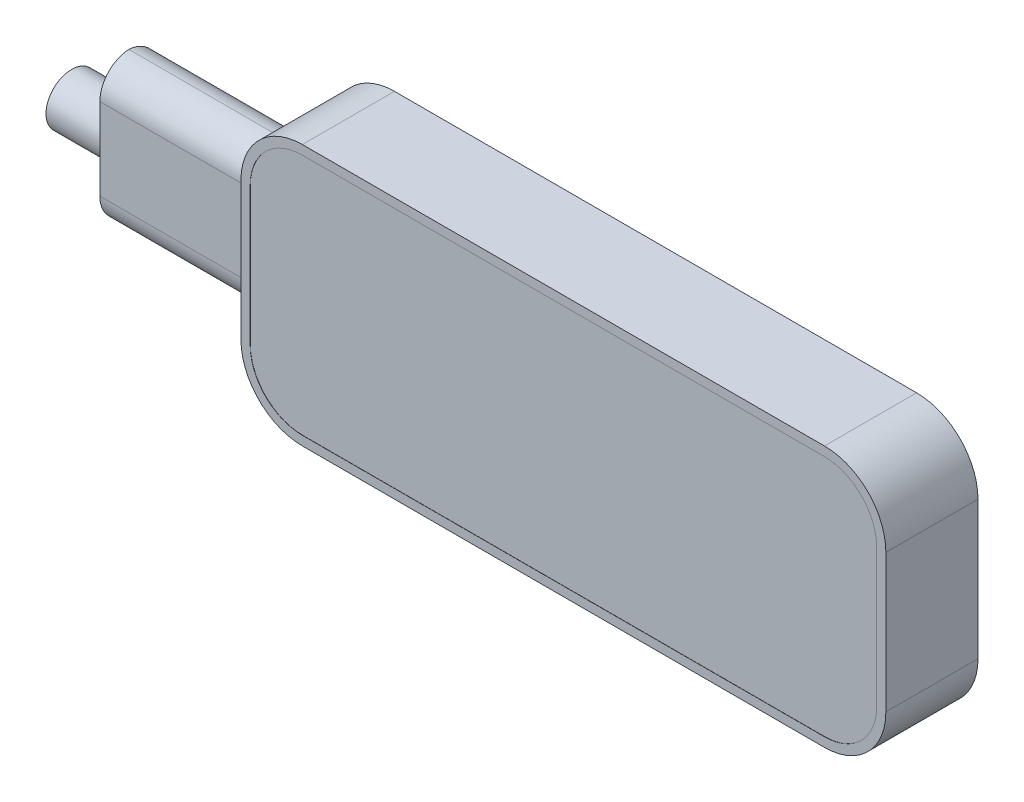
ISO-10303-21;
HEADER;
FILE_DESCRIPTION(('STEP AP214'),'2;1');
FILE_NAME('part.step','',(''),(''),'','','');
FILE_SCHEMA(('AUTOMOTIVE_DESIGN { 1 0 10303 214 1 1 1 1 }'));
ENDSEC;
DATA;
#1=APPLICATION_CONTEXT('core data for automotive mechanical design processes');
#2=APPLICATION_PROTOCOL_DEFINITION('international standard','automotive_design',2000,#1);
#3=PRODUCT_CONTEXT('',#1,'mechanical');
#4=PRODUCT('Part','Part','',(#3));
#5=PRODUCT_RELATED_PRODUCT_CATEGORY('part','',(#4));
#6=PRODUCT_DEFINITION_FORMATION('','',#4);
#7=PRODUCT_DEFINITION_CONTEXT('part definition',#1,'design');
#8=PRODUCT_DEFINITION('design','',#6,#7);
#9=PRODUCT_DEFINITION_SHAPE('','',#8);
#10=(LENGTH_UNIT() NAMED_UNIT(*) SI_UNIT(.MILLI.,.METRE.));
#11=(NAMED_UNIT(*) PLANE_ANGLE_UNIT() SI_UNIT($,.RADIAN.));
#12=(NAMED_UNIT(*) SI_UNIT($,.STERADIAN.) SOLID_ANGLE_UNIT());
#13=UNCERTAINTY_MEASURE_WITH_UNIT(LENGTH_MEASURE(1.E-05),#10,'distance_accuracy_value','');
#14=(GEOMETRIC_REPRESENTATION_CONTEXT(3) GLOBAL_UNCERTAINTY_ASSIGNED_CONTEXT((#13)) GLOBAL_UNIT_ASSIGNED_CONTEXT((#10,
#11,#12)) REPRESENTATION_CONTEXT('',''));
#15=CARTESIAN_POINT('',(0.,0.,0.));
#16=DIRECTION('',(0.,0.,1.));
#17=DIRECTION('',(1.,0.,0.));
#18=AXIS2_PLACEMENT_3D('',#15,#16,#17);
#19=CARTESIAN_POINT('',(-60.6806,8.88999999999998,8.26067024554706));
#20=DIRECTION('',(0.,0.,-1.));
#21=DIRECTION('',(0.,1.,0.));
#22=AXIS2_PLACEMENT_3D('',#19,#20,#21);
#23=PLANE('',#22);
#24=DIRECTION('',(0.,1.,0.));
#25=VECTOR('',#24,1.);
#26=CARTESIAN_POINT('',(-60.6806,8.88999999999998,8.26067024554706));
#27=LINE('',#26,#25);
#28=CARTESIAN_POINT('',(-60.6806,-5.08000000000001,8.26067024554706));
#29=VERTEX_POINT('',#28);
#30=CARTESIAN_POINT('',(-60.6806,5.07999999999999,8.26067024554706));
#31=VERTEX_POINT('',#30);
#32=EDGE_CURVE('E107',#29,#31,#27,.T.);
#33=ORIENTED_EDGE('',*,*,#32,.F.);
#34=DIRECTION('',(1.,0.,0.));
#35=VECTOR('',#34,1.);
#36=CARTESIAN_POINT('',(-60.6806,-5.08000000000001,8.26067024554706));
#37=LINE('',#36,#35);
#38=CARTESIAN_POINT('',(-40.0304,-5.08000000000001,8.26067024554706));
#39=VERTEX_POINT('',#38);
#40=EDGE_CURVE('E12',#29,#39,#37,.T.);
#41=ORIENTED_EDGE('',*,*,#40,.T.);
#42=DIRECTION('',(0.,1.,0.));
#43=VECTOR('',#42,1.);
#44=CARTESIAN_POINT('',(-40.0304,8.88999999999999,8.26067024554706));
#45=LINE('',#44,#43);
#46=CARTESIAN_POINT('',(-40.0304,5.07999999999999,8.26067024554706));
#47=VERTEX_POINT('',#46);
#48=EDGE_CURVE('E105',#39,#47,#45,.T.);
#49=ORIENTED_EDGE('',*,*,#48,.T.);
#50=DIRECTION('',(1.,0.,0.));
#51=VECTOR('',#50,1.);
#52=CARTESIAN_POINT('',(-60.6806,5.07999999999999,8.26067024554706));
#53=LINE('',#52,#51);
#54=EDGE_CURVE('E58',#47,#31,#53,.F.);
#55=ORIENTED_EDGE('',*,*,#54,.T.);
#56=EDGE_LOOP('',(#33,#41,#49,#55));
#57=FACE_BOUND('',#56,.T.);
#58=ADVANCED_FACE('F49',(#57),#23,.F.);
#59=CARTESIAN_POINT('',(-60.6806,8.88999999999998,1.07247024554706));
#60=DIRECTION('',(0.,0.,1.));
#61=DIRECTION('',(0.,-1.,0.));
#62=AXIS2_PLACEMENT_3D('',#59,#60,#61);
#63=PLANE('',#62);
#64=DIRECTION('',(0.,-1.,0.));
#65=VECTOR('',#64,1.);
#66=CARTESIAN_POINT('',(-40.0304,8.88999999999999,1.07247024554706));
#67=LINE('',#66,#65);
#68=CARTESIAN_POINT('',(-40.0304,5.07999999999999,1.07247024554706));
#69=VERTEX_POINT('',#68);
#70=CARTESIAN_POINT('',(-40.0304,-5.08000000000001,1.07247024554707));
#71=VERTEX_POINT('',#70);
#72=EDGE_CURVE('E116',#69,#71,#67,.T.);
#73=ORIENTED_EDGE('',*,*,#72,.T.);
#74=DIRECTION('',(1.,0.,0.));
#75=VECTOR('',#74,1.);
#76=CARTESIAN_POINT('',(-60.6806,-5.08000000000002,1.07247024554707));
#77=LINE('',#76,#75);
#78=CARTESIAN_POINT('',(-60.6806,-5.08000000000002,1.07247024554707));
#79=VERTEX_POINT('',#78);
#80=EDGE_CURVE('E132',#71,#79,#77,.F.);
#81=ORIENTED_EDGE('',*,*,#80,.T.);
#82=DIRECTION('',(0.,-1.,0.));
#83=VECTOR('',#82,1.);
#84=CARTESIAN_POINT('',(-60.6806,8.88999999999998,1.07247024554706));
#85=LINE('',#84,#83);
#86=CARTESIAN_POINT('',(-60.6806,5.07999999999998,1.07247024554706));
#87=VERTEX_POINT('',#86);
#88=EDGE_CURVE('E155',#87,#79,#85,.T.);
#89=ORIENTED_EDGE('',*,*,#88,.F.);
#90=DIRECTION('',(1.,0.,0.));
#91=VECTOR('',#90,1.);
#92=CARTESIAN_POINT('',(-60.6806,5.07999999999998,1.07247024554706));
#93=LINE('',#92,#91);
#94=EDGE_CURVE('E125',#87,#69,#93,.T.);
#95=ORIENTED_EDGE('',*,*,#94,.T.);
#96=EDGE_LOOP('',(#73,#81,#89,#95));
#97=FACE_BOUND('',#96,.T.);
#98=ADVANCED_FACE('F161',(#97),#63,.F.);
#99=CARTESIAN_POINT('',(-60.6806,0.,0.));
#100=DIRECTION('',(-1.,0.,0.));
#101=DIRECTION('',(0.,0.,1.));
#102=AXIS2_PLACEMENT_3D('',#99,#100,#101);
#103=PLANE('',#102);
#104=CARTESIAN_POINT('',(-60.6806,0.,4.65366807469536));
#105=DIRECTION('',(-1.,0.,0.));
#106=DIRECTION('',(0.,0.,1.));
#107=AXIS2_PLACEMENT_3D('',#104,#105,#106);
#108=CIRCLE('',#107,3.175);
#109=CARTESIAN_POINT('',(-60.6806,0.,7.82866807469536));
#110=VERTEX_POINT('',#109);
#111=EDGE_CURVE('E147',#110,#110,#108,.T.);
#112=ORIENTED_EDGE('',*,*,#111,.F.);
#113=EDGE_LOOP('',(#112));
#114=FACE_BOUND('',#113,.T.);
#115=ORIENTED_EDGE('',*,*,#88,.T.);
#116=CARTESIAN_POINT('',(-60.6806,-5.08000000000001,4.88247024554706));
#117=DIRECTION('',(-1.,0.,0.));
#118=DIRECTION('',(0.,0.,1.));
#119=AXIS2_PLACEMENT_3D('',#116,#117,#118);
#120=CIRCLE('',#119,3.81);
#121=CARTESIAN_POINT('',(-60.6806,-8.88387791470758,4.66657024554707));
#122=VERTEX_POINT('',#121);
#123=EDGE_CURVE('E66',#79,#122,#120,.T.);
#124=ORIENTED_EDGE('',*,*,#123,.T.);
#125=CARTESIAN_POINT('',(-60.6806,-5.08000000000001,4.45067024554707));
#126=DIRECTION('',(-1.,0.,0.));
#127=DIRECTION('',(0.,0.,1.));
#128=AXIS2_PLACEMENT_3D('',#125,#126,#127);
#129=CIRCLE('',#128,3.81);
#130=EDGE_CURVE('E138',#122,#29,#129,.T.);
#131=ORIENTED_EDGE('',*,*,#130,.T.);
#132=ORIENTED_EDGE('',*,*,#32,.T.);
#133=CARTESIAN_POINT('',(-60.6806,5.07999999999999,4.45067024554706));
#134=DIRECTION('',(-1.,0.,0.));
#135=DIRECTION('',(0.,0.,1.));
#136=AXIS2_PLACEMENT_3D('',#133,#134,#135);
#137=CIRCLE('',#136,3.81);
#138=CARTESIAN_POINT('',(-60.6806,8.88387791470755,4.66657024554706));
#139=VERTEX_POINT('',#138);
#140=EDGE_CURVE('E73',#31,#139,#137,.T.);
#141=ORIENTED_EDGE('',*,*,#140,.T.);
#142=CARTESIAN_POINT('',(-60.6806,5.07999999999999,4.88247024554706));
#143=DIRECTION('',(-1.,0.,0.));
#144=DIRECTION('',(0.,0.,1.));
#145=AXIS2_PLACEMENT_3D('',#142,#143,#144);
#146=CIRCLE('',#145,3.81);
#147=EDGE_CURVE('E136',#139,#87,#146,.T.);
#148=ORIENTED_EDGE('',*,*,#147,.T.);
#149=EDGE_LOOP('',(#115,#124,#131,#132,#141,#148));
#150=FACE_BOUND('',#149,.T.);
#151=ADVANCED_FACE('F179',(#114,#150),#103,.T.);
#152=CARTESIAN_POINT('',(-40.0304,0.,0.));
#153=DIRECTION('',(-1.,0.,0.));
#154=DIRECTION('',(0.,0.,1.));
#155=AXIS2_PLACEMENT_3D('',#152,#153,#154);
#156=PLANE('',#155);
#157=CARTESIAN_POINT('',(-40.0304,-5.08000000000001,4.45067024554707));
#158=DIRECTION('',(-1.,0.,0.));
#159=DIRECTION('',(0.,0.,1.));
#160=AXIS2_PLACEMENT_3D('',#157,#158,#159);
#161=CIRCLE('',#160,3.81);
#162=CARTESIAN_POINT('',(-40.0304,-8.88387791470758,4.66657024554707));
#163=VERTEX_POINT('',#162);
#164=EDGE_CURVE('E112',#39,#163,#161,.F.);
#165=ORIENTED_EDGE('',*,*,#164,.T.);
#166=CARTESIAN_POINT('',(-40.0304,-5.08000000000001,4.88247024554706));
#167=DIRECTION('',(-1.,0.,0.));
#168=DIRECTION('',(0.,0.,1.));
#169=AXIS2_PLACEMENT_3D('',#166,#167,#168);
#170=CIRCLE('',#169,3.81);
#171=EDGE_CURVE('E122',#163,#71,#170,.F.);
#172=ORIENTED_EDGE('',*,*,#171,.T.);
#173=ORIENTED_EDGE('',*,*,#72,.F.);
#174=CARTESIAN_POINT('',(-40.0304,5.07999999999999,4.88247024554706));
#175=DIRECTION('',(-1.,0.,0.));
#176=DIRECTION('',(0.,0.,1.));
#177=AXIS2_PLACEMENT_3D('',#174,#175,#176);
#178=CIRCLE('',#177,3.81);
#179=CARTESIAN_POINT('',(-40.0304,8.88387791470756,4.66657024554706));
#180=VERTEX_POINT('',#179);
#181=EDGE_CURVE('E123',#69,#180,#178,.F.);
#182=ORIENTED_EDGE('',*,*,#181,.T.);
#183=CARTESIAN_POINT('',(-40.0304,5.07999999999999,4.45067024554706));
#184=DIRECTION('',(-1.,0.,0.));
#185=DIRECTION('',(0.,0.,1.));
#186=AXIS2_PLACEMENT_3D('',#183,#184,#185);
#187=CIRCLE('',#186,3.81);
#188=EDGE_CURVE('E115',#180,#47,#187,.F.);
#189=ORIENTED_EDGE('',*,*,#188,.T.);
#190=ORIENTED_EDGE('',*,*,#48,.F.);
#191=EDGE_LOOP('',(#165,#172,#173,#182,#189,#190));
#192=FACE_BOUND('',#191,.T.);
#193=ADVANCED_FACE('F111',(#192),#156,.F.);
#194=CARTESIAN_POINT('',(-60.6806,-5.08000000000001,4.45067024554707));
#195=DIRECTION('',(1.,0.,0.));
#196=DIRECTION('',(0.,1.,0.));
#197=AXIS2_PLACEMENT_3D('',#194,#195,#196);
#198=CYLINDRICAL_SURFACE('',#197,3.81);
#199=ORIENTED_EDGE('',*,*,#40,.F.);
#200=ORIENTED_EDGE('',*,*,#130,.F.);
#201=DIRECTION('',(1.,0.,0.));
#202=VECTOR('',#201,1.);
#203=CARTESIAN_POINT('',(-50.3555,-8.88387791470758,4.66657024554707));
#204=LINE('',#203,#202);
#205=EDGE_CURVE('E117',#163,#122,#204,.F.);
#206=ORIENTED_EDGE('',*,*,#205,.F.);
#207=ORIENTED_EDGE('',*,*,#164,.F.);
#208=EDGE_LOOP('',(#199,#200,#206,#207));
#209=FACE_BOUND('',#208,.T.);
#210=ADVANCED_FACE('F119',(#209),#198,.T.);
#211=CARTESIAN_POINT('',(-60.6806,-5.08000000000001,4.88247024554706));
#212=DIRECTION('',(1.,0.,0.));
#213=DIRECTION('',(0.,1.,0.));
#214=AXIS2_PLACEMENT_3D('',#211,#212,#213);
#215=CYLINDRICAL_SURFACE('',#214,3.81);
#216=ORIENTED_EDGE('',*,*,#123,.F.);
#217=ORIENTED_EDGE('',*,*,#80,.F.);
#218=ORIENTED_EDGE('',*,*,#171,.F.);
#219=ORIENTED_EDGE('',*,*,#205,.T.);
#220=EDGE_LOOP('',(#216,#217,#218,#219));
#221=FACE_BOUND('',#220,.T.);
#222=ADVANCED_FACE('F164',(#221),#215,.T.);
#223=CARTESIAN_POINT('',(-60.6806,5.07999999999999,4.45067024554706));
#224=DIRECTION('',(1.,0.,0.));
#225=DIRECTION('',(0.,1.,0.));
#226=AXIS2_PLACEMENT_3D('',#223,#224,#225);
#227=CYLINDRICAL_SURFACE('',#226,3.81);
#228=DIRECTION('',(1.,0.,0.));
#229=VECTOR('',#228,1.);
#230=CARTESIAN_POINT('',(-50.3555,8.88387791470756,4.66657024554706));
#231=LINE('',#230,#229);
#232=EDGE_CURVE('E53',#139,#180,#231,.T.);
#233=ORIENTED_EDGE('',*,*,#232,.F.);
#234=ORIENTED_EDGE('',*,*,#140,.F.);
#235=ORIENTED_EDGE('',*,*,#54,.F.);
#236=ORIENTED_EDGE('',*,*,#188,.F.);
#237=EDGE_LOOP('',(#233,#234,#235,#236));
#238=FACE_BOUND('',#237,.T.);
#239=ADVANCED_FACE('F51',(#238),#227,.T.);
#240=CARTESIAN_POINT('',(-60.6806,5.07999999999999,4.88247024554706));
#241=DIRECTION('',(1.,0.,0.));
#242=DIRECTION('',(0.,1.,0.));
#243=AXIS2_PLACEMENT_3D('',#240,#241,#242);
#244=CYLINDRICAL_SURFACE('',#243,3.81);
#245=ORIENTED_EDGE('',*,*,#147,.F.);
#246=ORIENTED_EDGE('',*,*,#232,.T.);
#247=ORIENTED_EDGE('',*,*,#181,.F.);
#248=ORIENTED_EDGE('',*,*,#94,.F.);
#249=EDGE_LOOP('',(#245,#246,#247,#248));
#250=FACE_BOUND('',#249,.T.);
#251=ADVANCED_FACE('F171',(#250),#244,.T.);
#252=CARTESIAN_POINT('',(-67.7926,0.,4.65366807469536));
#253=DIRECTION('',(1.,0.,0.));
#254=DIRECTION('',(0.,0.,-1.));
#255=AXIS2_PLACEMENT_3D('',#252,#253,#254);
#256=CYLINDRICAL_SURFACE('',#255,3.175);
#257=CARTESIAN_POINT('',(-67.7926,0.,4.65366807469536));
#258=DIRECTION('',(-1.,0.,0.));
#259=DIRECTION('',(0.,0.,1.));
#260=AXIS2_PLACEMENT_3D('',#257,#258,#259);
#261=CIRCLE('',#260,3.175);
#262=CARTESIAN_POINT('',(-67.7926,0.,7.82866807469536));
#263=VERTEX_POINT('',#262);
#264=EDGE_CURVE('E143',#263,#263,#261,.T.);
#265=ORIENTED_EDGE('',*,*,#264,.F.);
#266=EDGE_LOOP('',(#265));
#267=FACE_BOUND('',#266,.T.);
#268=ORIENTED_EDGE('',*,*,#111,.T.);
#269=EDGE_LOOP('',(#268));
#270=FACE_BOUND('',#269,.T.);
#271=ADVANCED_FACE('F187',(#267,#270),#256,.T.);
#272=CARTESIAN_POINT('',(-67.7926,0.,4.65366807469536));
#273=DIRECTION('',(-1.,0.,0.));
#274=DIRECTION('',(0.,0.,1.));
#275=AXIS2_PLACEMENT_3D('',#272,#273,#274);
#276=PLANE('',#275);
#277=ORIENTED_EDGE('',*,*,#264,.T.);
#278=EDGE_LOOP('',(#277));
#279=FACE_BOUND('',#278,.T.);
#280=ADVANCED_FACE('F190',(#279),#276,.T.);
#281=CLOSED_SHELL('',(#58,#98,#151,#193,#210,#222,#239,#251,#271,#280));
#282=MANIFOLD_SOLID_BREP('B2',#281);
#283=CARTESIAN_POINT('',(-40.005,16.1925,11.43));
#284=DIRECTION('',(1.,0.,0.));
#285=DIRECTION('',(0.,1.,0.));
#286=AXIS2_PLACEMENT_3D('',#283,#284,#285);
#287=PLANE('',#286);
#288=DIRECTION('',(0.,0.,-1.));
#289=VECTOR('',#288,1.);
#290=CARTESIAN_POINT('',(-40.005,6.73099999999999,2.56361871542765));
#291=LINE('',#290,#289);
#292=CARTESIAN_POINT('',(-40.005,6.73099999999999,5.73861871542765));
#293=VERTEX_POINT('',#292);
#294=CARTESIAN_POINT('',(-40.005,6.73099999999999,2.56361871542765));
#295=VERTEX_POINT('',#294);
#296=EDGE_CURVE('E421',#293,#295,#291,.T.);
#297=ORIENTED_EDGE('',*,*,#296,.F.);
#298=DIRECTION('',(0.,1.,0.));
#299=VECTOR('',#298,1.);
#300=CARTESIAN_POINT('',(-40.005,6.73099999999999,5.73861871542765));
#301=LINE('',#300,#299);
#302=CARTESIAN_POINT('',(-40.005,-6.73100000000001,5.73861871542765));
#303=VERTEX_POINT('',#302);
#304=EDGE_CURVE('E270',#303,#293,#301,.T.);
#305=ORIENTED_EDGE('',*,*,#304,.F.);
#306=DIRECTION('',(0.,0.,1.));
#307=VECTOR('',#306,1.);
#308=CARTESIAN_POINT('',(-40.005,-6.73100000000001,2.56361871542765));
#309=LINE('',#308,#307);
#310=CARTESIAN_POINT('',(-40.005,-6.73100000000001,2.56361871542765));
#311=VERTEX_POINT('',#310);
#312=EDGE_CURVE('E412',#311,#303,#309,.T.);
#313=ORIENTED_EDGE('',*,*,#312,.F.);
#314=DIRECTION('',(0.,-1.,0.));
#315=VECTOR('',#314,1.);
#316=CARTESIAN_POINT('',(-40.005,6.73099999999999,2.56361871542765));
#317=LINE('',#316,#315);
#318=EDGE_CURVE('E415',#295,#311,#317,.T.);
#319=ORIENTED_EDGE('',*,*,#318,.F.);
#320=EDGE_LOOP('',(#297,#305,#313,#319));
#321=FACE_BOUND('',#320,.T.);
#322=DIRECTION('',(0.,-1.,0.));
#323=VECTOR('',#322,1.);
#324=CARTESIAN_POINT('',(-40.005,16.1925,0.));
#325=LINE('',#324,#323);
#326=CARTESIAN_POINT('',(-40.005,8.57249999999999,0.));
#327=VERTEX_POINT('',#326);
#328=CARTESIAN_POINT('',(-40.005,-8.5725,0.));
#329=VERTEX_POINT('',#328);
#330=EDGE_CURVE('E479',#327,#329,#325,.T.);
#331=ORIENTED_EDGE('',*,*,#330,.T.);
#332=DIRECTION('',(0.,0.,-1.));
#333=VECTOR('',#332,1.);
#334=CARTESIAN_POINT('',(-40.005,-8.5725,11.43));
#335=LINE('',#334,#333);
#336=CARTESIAN_POINT('',(-40.005,-8.5725,11.43));
#337=VERTEX_POINT('',#336);
#338=EDGE_CURVE('E532',#329,#337,#335,.F.);
#339=ORIENTED_EDGE('',*,*,#338,.T.);
#340=DIRECTION('',(0.,-1.,0.));
#341=VECTOR('',#340,1.);
#342=CARTESIAN_POINT('',(-40.005,16.1925,11.43));
#343=LINE('',#342,#341);
#344=CARTESIAN_POINT('',(-40.005,8.57249999999999,11.43));
#345=VERTEX_POINT('',#344);
#346=EDGE_CURVE('E493',#345,#337,#343,.T.);
#347=ORIENTED_EDGE('',*,*,#346,.F.);
#348=DIRECTION('',(0.,0.,-1.));
#349=VECTOR('',#348,1.);
#350=CARTESIAN_POINT('',(-40.005,8.57249999999999,11.43));
#351=LINE('',#350,#349);
#352=EDGE_CURVE('E529',#345,#327,#351,.T.);
#353=ORIENTED_EDGE('',*,*,#352,.T.);
#354=EDGE_LOOP('',(#331,#339,#347,#353));
#355=FACE_BOUND('',#354,.T.);
#356=ADVANCED_FACE('F255',(#321,#355),#287,.F.);
#357=CARTESIAN_POINT('',(40.005,-16.1925,11.43));
#358=DIRECTION('',(0.,1.,0.));
#359=DIRECTION('',(-1.,0.,0.));
#360=AXIS2_PLACEMENT_3D('',#357,#358,#359);
#361=PLANE('',#360);
#362=DIRECTION('',(1.,0.,0.));
#363=VECTOR('',#362,1.);
#364=CARTESIAN_POINT('',(40.005,-16.1925,11.43));
#365=LINE('',#364,#363);
#366=CARTESIAN_POINT('',(-32.385,-16.1925,11.43));
#367=VERTEX_POINT('',#366);
#368=CARTESIAN_POINT('',(32.385,-16.1925,11.43));
#369=VERTEX_POINT('',#368);
#370=EDGE_CURVE('E496',#367,#369,#365,.T.);
#371=ORIENTED_EDGE('',*,*,#370,.F.);
#372=DIRECTION('',(0.,0.,-1.));
#373=VECTOR('',#372,1.);
#374=CARTESIAN_POINT('',(-32.385,-16.1925,11.43));
#375=LINE('',#374,#373);
#376=CARTESIAN_POINT('',(-32.385,-16.1925,0.));
#377=VERTEX_POINT('',#376);
#378=EDGE_CURVE('E518',#367,#377,#375,.T.);
#379=ORIENTED_EDGE('',*,*,#378,.T.);
#380=DIRECTION('',(1.,0.,0.));
#381=VECTOR('',#380,1.);
#382=CARTESIAN_POINT('',(40.005,-16.1925,0.));
#383=LINE('',#382,#381);
#384=CARTESIAN_POINT('',(32.385,-16.1925,0.));
#385=VERTEX_POINT('',#384);
#386=EDGE_CURVE('E509',#377,#385,#383,.T.);
#387=ORIENTED_EDGE('',*,*,#386,.T.);
#388=DIRECTION('',(0.,0.,-1.));
#389=VECTOR('',#388,1.);
#390=CARTESIAN_POINT('',(32.385,-16.1925,11.43));
#391=LINE('',#390,#389);
#392=EDGE_CURVE('E506',#385,#369,#391,.F.);
#393=ORIENTED_EDGE('',*,*,#392,.T.);
#394=EDGE_LOOP('',(#371,#379,#387,#393));
#395=FACE_BOUND('',#394,.T.);
#396=ADVANCED_FACE('F571',(#395),#361,.F.);
#397=CARTESIAN_POINT('',(40.005,16.1925,11.43));
#398=DIRECTION('',(-1.,0.,0.));
#399=DIRECTION('',(0.,-1.,0.));
#400=AXIS2_PLACEMENT_3D('',#397,#398,#399);
#401=PLANE('',#400);
#402=DIRECTION('',(0.,1.,0.));
#403=VECTOR('',#402,1.);
#404=CARTESIAN_POINT('',(40.005,16.1925,11.43));
#405=LINE('',#404,#403);
#406=CARTESIAN_POINT('',(40.005,-8.57249999999999,11.43));
#407=VERTEX_POINT('',#406);
#408=CARTESIAN_POINT('',(40.005,8.5725,11.43));
#409=VERTEX_POINT('',#408);
#410=EDGE_CURVE('E500',#407,#409,#405,.T.);
#411=ORIENTED_EDGE('',*,*,#410,.F.);
#412=DIRECTION('',(0.,0.,-1.));
#413=VECTOR('',#412,1.);
#414=CARTESIAN_POINT('',(40.005,-8.57249999999999,11.43));
#415=LINE('',#414,#413);
#416=CARTESIAN_POINT('',(40.005,-8.57249999999999,0.));
#417=VERTEX_POINT('',#416);
#418=EDGE_CURVE('E544',#407,#417,#415,.T.);
#419=ORIENTED_EDGE('',*,*,#418,.T.);
#420=DIRECTION('',(0.,1.,0.));
#421=VECTOR('',#420,1.);
#422=CARTESIAN_POINT('',(40.005,16.1925,0.));
#423=LINE('',#422,#421);
#424=CARTESIAN_POINT('',(40.005,8.5725,0.));
#425=VERTEX_POINT('',#424);
#426=EDGE_CURVE('E512',#417,#425,#423,.T.);
#427=ORIENTED_EDGE('',*,*,#426,.T.);
#428=DIRECTION('',(0.,0.,-1.));
#429=VECTOR('',#428,1.);
#430=CARTESIAN_POINT('',(40.005,8.5725,11.43));
#431=LINE('',#430,#429);
#432=EDGE_CURVE('E542',#425,#409,#431,.F.);
#433=ORIENTED_EDGE('',*,*,#432,.T.);
#434=EDGE_LOOP('',(#411,#419,#427,#433));
#435=FACE_BOUND('',#434,.T.);
#436=ADVANCED_FACE('F580',(#435),#401,.F.);
#437=CARTESIAN_POINT('',(40.005,16.1925,11.43));
#438=DIRECTION('',(0.,-1.,0.));
#439=DIRECTION('',(1.,0.,0.));
#440=AXIS2_PLACEMENT_3D('',#437,#438,#439);
#441=PLANE('',#440);
#442=DIRECTION('',(-1.,0.,0.));
#443=VECTOR('',#442,1.);
#444=CARTESIAN_POINT('',(40.005,16.1925,11.43));
#445=LINE('',#444,#443);
#446=CARTESIAN_POINT('',(32.385,16.1925,11.43));
#447=VERTEX_POINT('',#446);
#448=CARTESIAN_POINT('',(-32.385,16.1925,11.43));
#449=VERTEX_POINT('',#448);
#450=EDGE_CURVE('E503',#447,#449,#445,.T.);
#451=ORIENTED_EDGE('',*,*,#450,.F.);
#452=DIRECTION('',(0.,0.,-1.));
#453=VECTOR('',#452,1.);
#454=CARTESIAN_POINT('',(32.385,16.1925,11.43));
#455=LINE('',#454,#453);
#456=CARTESIAN_POINT('',(32.385,16.1925,0.));
#457=VERTEX_POINT('',#456);
#458=EDGE_CURVE('E47',#447,#457,#455,.T.);
#459=ORIENTED_EDGE('',*,*,#458,.T.);
#460=DIRECTION('',(-1.,0.,0.));
#461=VECTOR('',#460,1.);
#462=CARTESIAN_POINT('',(40.005,16.1925,0.));
#463=LINE('',#462,#461);
#464=CARTESIAN_POINT('',(-32.385,16.1925,0.));
#465=VERTEX_POINT('',#464);
#466=EDGE_CURVE('E497',#457,#465,#463,.T.);
#467=ORIENTED_EDGE('',*,*,#466,.T.);
#468=DIRECTION('',(0.,0.,-1.));
#469=VECTOR('',#468,1.);
#470=CARTESIAN_POINT('',(-32.385,16.1925,11.43));
#471=LINE('',#470,#469);
#472=EDGE_CURVE('E263',#465,#449,#471,.F.);
#473=ORIENTED_EDGE('',*,*,#472,.T.);
#474=EDGE_LOOP('',(#451,#459,#467,#473));
#475=FACE_BOUND('',#474,.T.);
#476=ADVANCED_FACE('F549',(#475),#441,.F.);
#477=CARTESIAN_POINT('',(0.,0.,11.43));
#478=DIRECTION('',(0.,0.,-1.));
#479=DIRECTION('',(-1.,0.,0.));
#480=AXIS2_PLACEMENT_3D('',#477,#478,#479);
#481=PLANE('',#480);
#482=DIRECTION('',(0.,-1.,0.));
#483=VECTOR('',#482,1.);
#484=CARTESIAN_POINT('',(-38.862,8.57249999999999,11.43));
#485=LINE('',#484,#483);
#486=CARTESIAN_POINT('',(-38.862,8.57249999999999,11.43));
#487=VERTEX_POINT('',#486);
#488=CARTESIAN_POINT('',(-38.862,-8.57250000000001,11.43));
#489=VERTEX_POINT('',#488);
#490=EDGE_CURVE('E457',#487,#489,#485,.T.);
#491=ORIENTED_EDGE('',*,*,#490,.F.);
#492=CARTESIAN_POINT('',(-32.385,8.57249999999999,11.43));
#493=DIRECTION('',(0.,0.,1.));
#494=DIRECTION('',(1.,0.,0.));
#495=AXIS2_PLACEMENT_3D('',#492,#493,#494);
#496=CIRCLE('',#495,6.477);
#497=CARTESIAN_POINT('',(-32.385,15.0495,11.43));
#498=VERTEX_POINT('',#497);
#499=EDGE_CURVE('E278',#498,#487,#496,.T.);
#500=ORIENTED_EDGE('',*,*,#499,.F.);
#501=DIRECTION('',(-1.,0.,0.));
#502=VECTOR('',#501,1.);
#503=CARTESIAN_POINT('',(32.385,15.0495,11.43));
#504=LINE('',#503,#502);
#505=CARTESIAN_POINT('',(32.385,15.0495,11.43));
#506=VERTEX_POINT('',#505);
#507=EDGE_CURVE('E434',#506,#498,#504,.T.);
#508=ORIENTED_EDGE('',*,*,#507,.F.);
#509=CARTESIAN_POINT('',(32.385,8.5725,11.43));
#510=DIRECTION('',(0.,0.,1.));
#511=DIRECTION('',(1.,0.,0.));
#512=AXIS2_PLACEMENT_3D('',#509,#510,#511);
#513=CIRCLE('',#512,6.477);
#514=CARTESIAN_POINT('',(38.862,8.5725,11.43));
#515=VERTEX_POINT('',#514);
#516=EDGE_CURVE('E472',#515,#506,#513,.T.);
#517=ORIENTED_EDGE('',*,*,#516,.F.);
#518=DIRECTION('',(0.,1.,0.));
#519=VECTOR('',#518,1.);
#520=CARTESIAN_POINT('',(38.862,-8.5725,11.43));
#521=LINE('',#520,#519);
#522=CARTESIAN_POINT('',(38.862,-8.5725,11.43));
#523=VERTEX_POINT('',#522);
#524=EDGE_CURVE('E469',#523,#515,#521,.T.);
#525=ORIENTED_EDGE('',*,*,#524,.F.);
#526=CARTESIAN_POINT('',(32.385,-8.5725,11.43));
#527=DIRECTION('',(0.,0.,1.));
#528=DIRECTION('',(1.,0.,0.));
#529=AXIS2_PLACEMENT_3D('',#526,#527,#528);
#530=CIRCLE('',#529,6.477);
#531=CARTESIAN_POINT('',(32.385,-15.0495,11.43));
#532=VERTEX_POINT('',#531);
#533=EDGE_CURVE('E466',#532,#523,#530,.T.);
#534=ORIENTED_EDGE('',*,*,#533,.F.);
#535=DIRECTION('',(1.,0.,0.));
#536=VECTOR('',#535,1.);
#537=CARTESIAN_POINT('',(-32.385,-15.0495,11.43));
#538=LINE('',#537,#536);
#539=CARTESIAN_POINT('',(-32.385,-15.0495,11.43));
#540=VERTEX_POINT('',#539);
#541=EDGE_CURVE('E463',#540,#532,#538,.T.);
#542=ORIENTED_EDGE('',*,*,#541,.F.);
#543=CARTESIAN_POINT('',(-32.385,-8.5725,11.43));
#544=DIRECTION('',(0.,0.,1.));
#545=DIRECTION('',(1.,0.,0.));
#546=AXIS2_PLACEMENT_3D('',#543,#544,#545);
#547=CIRCLE('',#546,6.477);
#548=EDGE_CURVE('E460',#489,#540,#547,.T.);
#549=ORIENTED_EDGE('',*,*,#548,.F.);
#550=EDGE_LOOP('',(#491,#500,#508,#517,#525,#534,#542,#549));
#551=FACE_BOUND('',#550,.T.);
#552=ORIENTED_EDGE('',*,*,#346,.T.);
#553=CARTESIAN_POINT('',(-32.385,-8.5725,11.43));
#554=DIRECTION('',(0.,0.,-1.));
#555=DIRECTION('',(-1.,0.,0.));
#556=AXIS2_PLACEMENT_3D('',#553,#554,#555);
#557=CIRCLE('',#556,7.62);
#558=EDGE_CURVE('E540',#337,#367,#557,.F.);
#559=ORIENTED_EDGE('',*,*,#558,.T.);
#560=ORIENTED_EDGE('',*,*,#370,.T.);
#561=CARTESIAN_POINT('',(32.385,-8.5725,11.43));
#562=DIRECTION('',(0.,0.,-1.));
#563=DIRECTION('',(-1.,0.,0.));
#564=AXIS2_PLACEMENT_3D('',#561,#562,#563);
#565=CIRCLE('',#564,7.62);
#566=EDGE_CURVE('E538',#369,#407,#565,.F.);
#567=ORIENTED_EDGE('',*,*,#566,.T.);
#568=ORIENTED_EDGE('',*,*,#410,.T.);
#569=CARTESIAN_POINT('',(32.385,8.5725,11.43));
#570=DIRECTION('',(0.,0.,-1.));
#571=DIRECTION('',(-1.,0.,0.));
#572=AXIS2_PLACEMENT_3D('',#569,#570,#571);
#573=CIRCLE('',#572,7.62);
#574=EDGE_CURVE('E536',#409,#447,#573,.F.);
#575=ORIENTED_EDGE('',*,*,#574,.T.);
#576=ORIENTED_EDGE('',*,*,#450,.T.);
#577=CARTESIAN_POINT('',(-32.385,8.57249999999999,11.43));
#578=DIRECTION('',(0.,0.,-1.));
#579=DIRECTION('',(-1.,0.,0.));
#580=AXIS2_PLACEMENT_3D('',#577,#578,#579);
#581=CIRCLE('',#580,7.62);
#582=EDGE_CURVE('E534',#449,#345,#581,.F.);
#583=ORIENTED_EDGE('',*,*,#582,.T.);
#584=EDGE_LOOP('',(#552,#559,#560,#567,#568,#575,#576,#583));
#585=FACE_BOUND('',#584,.T.);
#586=ADVANCED_FACE('F555',(#551,#585),#481,.F.);
#587=CARTESIAN_POINT('',(0.,0.,0.));
#588=DIRECTION('',(0.,0.,-1.));
#589=DIRECTION('',(-1.,0.,0.));
#590=AXIS2_PLACEMENT_3D('',#587,#588,#589);
#591=PLANE('',#590);
#592=ORIENTED_EDGE('',*,*,#386,.F.);
#593=CARTESIAN_POINT('',(-32.385,-8.5725,0.));
#594=DIRECTION('',(0.,0.,-1.));
#595=DIRECTION('',(-1.,0.,0.));
#596=AXIS2_PLACEMENT_3D('',#593,#594,#595);
#597=CIRCLE('',#596,7.62);
#598=EDGE_CURVE('E527',#377,#329,#597,.T.);
#599=ORIENTED_EDGE('',*,*,#598,.T.);
#600=ORIENTED_EDGE('',*,*,#330,.F.);
#601=CARTESIAN_POINT('',(-32.385,8.57249999999999,0.));
#602=DIRECTION('',(0.,0.,-1.));
#603=DIRECTION('',(-1.,0.,0.));
#604=AXIS2_PLACEMENT_3D('',#601,#602,#603);
#605=CIRCLE('',#604,7.62);
#606=EDGE_CURVE('E521',#327,#465,#605,.T.);
#607=ORIENTED_EDGE('',*,*,#606,.T.);
#608=ORIENTED_EDGE('',*,*,#466,.F.);
#609=CARTESIAN_POINT('',(32.385,8.5725,0.));
#610=DIRECTION('',(0.,0.,-1.));
#611=DIRECTION('',(-1.,0.,0.));
#612=AXIS2_PLACEMENT_3D('',#609,#610,#611);
#613=CIRCLE('',#612,7.62);
#614=EDGE_CURVE('E523',#457,#425,#613,.T.);
#615=ORIENTED_EDGE('',*,*,#614,.T.);
#616=ORIENTED_EDGE('',*,*,#426,.F.);
#617=CARTESIAN_POINT('',(32.385,-8.5725,0.));
#618=DIRECTION('',(0.,0.,-1.));
#619=DIRECTION('',(-1.,0.,0.));
#620=AXIS2_PLACEMENT_3D('',#617,#618,#619);
#621=CIRCLE('',#620,7.62);
#622=EDGE_CURVE('E525',#417,#385,#621,.T.);
#623=ORIENTED_EDGE('',*,*,#622,.T.);
#624=EDGE_LOOP('',(#592,#599,#600,#607,#608,#615,#616,#623));
#625=FACE_BOUND('',#624,.T.);
#626=ADVANCED_FACE('F564',(#625),#591,.T.);
#627=CARTESIAN_POINT('',(-32.385,-8.5725,11.43));
#628=DIRECTION('',(0.,0.,-1.));
#629=DIRECTION('',(-1.,0.,0.));
#630=AXIS2_PLACEMENT_3D('',#627,#628,#629);
#631=CYLINDRICAL_SURFACE('',#630,7.62);
#632=ORIENTED_EDGE('',*,*,#558,.F.);
#633=ORIENTED_EDGE('',*,*,#338,.F.);
#634=ORIENTED_EDGE('',*,*,#598,.F.);
#635=ORIENTED_EDGE('',*,*,#378,.F.);
#636=EDGE_LOOP('',(#632,#633,#634,#635));
#637=FACE_BOUND('',#636,.T.);
#638=ADVANCED_FACE('F568',(#637),#631,.T.);
#639=CARTESIAN_POINT('',(32.385,-8.5725,11.43));
#640=DIRECTION('',(0.,0.,-1.));
#641=DIRECTION('',(-1.,0.,0.));
#642=AXIS2_PLACEMENT_3D('',#639,#640,#641);
#643=CYLINDRICAL_SURFACE('',#642,7.62);
#644=ORIENTED_EDGE('',*,*,#566,.F.);
#645=ORIENTED_EDGE('',*,*,#392,.F.);
#646=ORIENTED_EDGE('',*,*,#622,.F.);
#647=ORIENTED_EDGE('',*,*,#418,.F.);
#648=EDGE_LOOP('',(#644,#645,#646,#647));
#649=FACE_BOUND('',#648,.T.);
#650=ADVANCED_FACE('F577',(#649),#643,.T.);
#651=CARTESIAN_POINT('',(32.385,8.5725,11.43));
#652=DIRECTION('',(0.,0.,-1.));
#653=DIRECTION('',(-1.,0.,0.));
#654=AXIS2_PLACEMENT_3D('',#651,#652,#653);
#655=CYLINDRICAL_SURFACE('',#654,7.62);
#656=ORIENTED_EDGE('',*,*,#574,.F.);
#657=ORIENTED_EDGE('',*,*,#432,.F.);
#658=ORIENTED_EDGE('',*,*,#614,.F.);
#659=ORIENTED_EDGE('',*,*,#458,.F.);
#660=EDGE_LOOP('',(#656,#657,#658,#659));
#661=FACE_BOUND('',#660,.T.);
#662=ADVANCED_FACE('F583',(#661),#655,.T.);
#663=CARTESIAN_POINT('',(-32.385,8.57249999999999,11.43));
#664=DIRECTION('',(0.,0.,-1.));
#665=DIRECTION('',(-1.,0.,0.));
#666=AXIS2_PLACEMENT_3D('',#663,#664,#665);
#667=CYLINDRICAL_SURFACE('',#666,7.62);
#668=ORIENTED_EDGE('',*,*,#582,.F.);
#669=ORIENTED_EDGE('',*,*,#472,.F.);
#670=ORIENTED_EDGE('',*,*,#606,.F.);
#671=ORIENTED_EDGE('',*,*,#352,.F.);
#672=EDGE_LOOP('',(#668,#669,#670,#671));
#673=FACE_BOUND('',#672,.T.);
#674=ADVANCED_FACE('F257',(#673),#667,.T.);
#675=CARTESIAN_POINT('',(-32.385,8.57249999999999,11.4046));
#676=DIRECTION('',(0.,0.,1.));
#677=DIRECTION('',(1.,0.,0.));
#678=AXIS2_PLACEMENT_3D('',#675,#676,#677);
#679=CYLINDRICAL_SURFACE('',#678,6.477);
#680=ORIENTED_EDGE('',*,*,#499,.T.);
#681=DIRECTION('',(0.,0.,1.));
#682=VECTOR('',#681,1.);
#683=CARTESIAN_POINT('',(-38.862,8.57249999999999,11.4046));
#684=LINE('',#683,#682);
#685=CARTESIAN_POINT('',(-38.862,8.57249999999999,11.4046));
#686=VERTEX_POINT('',#685);
#687=EDGE_CURVE('E455',#686,#487,#684,.T.);
#688=ORIENTED_EDGE('',*,*,#687,.F.);
#689=CARTESIAN_POINT('',(-32.385,8.57249999999999,11.4046));
#690=DIRECTION('',(0.,0.,1.));
#691=DIRECTION('',(1.,0.,0.));
#692=AXIS2_PLACEMENT_3D('',#689,#690,#691);
#693=CIRCLE('',#692,6.477);
#694=CARTESIAN_POINT('',(-32.385,15.0495,11.4046));
#695=VERTEX_POINT('',#694);
#696=EDGE_CURVE('E430',#695,#686,#693,.T.);
#697=ORIENTED_EDGE('',*,*,#696,.F.);
#698=DIRECTION('',(0.,0.,1.));
#699=VECTOR('',#698,1.);
#700=CARTESIAN_POINT('',(-32.385,15.0495,11.4046));
#701=LINE('',#700,#699);
#702=EDGE_CURVE('E477',#695,#498,#701,.T.);
#703=ORIENTED_EDGE('',*,*,#702,.T.);
#704=EDGE_LOOP('',(#680,#688,#697,#703));
#705=FACE_BOUND('',#704,.T.);
#706=ADVANCED_FACE('F589',(#705),#679,.F.);
#707=CARTESIAN_POINT('',(32.385,15.0495,11.4046));
#708=DIRECTION('',(0.,1.,0.));
#709=DIRECTION('',(-1.,0.,0.));
#710=AXIS2_PLACEMENT_3D('',#707,#708,#709);
#711=PLANE('',#710);
#712=ORIENTED_EDGE('',*,*,#507,.T.);
#713=ORIENTED_EDGE('',*,*,#702,.F.);
#714=DIRECTION('',(-1.,0.,0.));
#715=VECTOR('',#714,1.);
#716=CARTESIAN_POINT('',(32.385,15.0495,11.4046));
#717=LINE('',#716,#715);
#718=CARTESIAN_POINT('',(32.385,15.0495,11.4046));
#719=VERTEX_POINT('',#718);
#720=EDGE_CURVE('E452',#719,#695,#717,.T.);
#721=ORIENTED_EDGE('',*,*,#720,.F.);
#722=DIRECTION('',(0.,0.,1.));
#723=VECTOR('',#722,1.);
#724=CARTESIAN_POINT('',(32.385,15.0495,11.4046));
#725=LINE('',#724,#723);
#726=EDGE_CURVE('E480',#719,#506,#725,.T.);
#727=ORIENTED_EDGE('',*,*,#726,.T.);
#728=EDGE_LOOP('',(#712,#713,#721,#727));
#729=FACE_BOUND('',#728,.T.);
#730=ADVANCED_FACE('F639',(#729),#711,.F.);
#731=CARTESIAN_POINT('',(32.385,8.5725,11.4046));
#732=DIRECTION('',(0.,0.,1.));
#733=DIRECTION('',(1.,0.,0.));
#734=AXIS2_PLACEMENT_3D('',#731,#732,#733);
#735=CYLINDRICAL_SURFACE('',#734,6.477);
#736=ORIENTED_EDGE('',*,*,#516,.T.);
#737=ORIENTED_EDGE('',*,*,#726,.F.);
#738=CARTESIAN_POINT('',(32.385,8.5725,11.4046));
#739=DIRECTION('',(0.,0.,1.));
#740=DIRECTION('',(1.,0.,0.));
#741=AXIS2_PLACEMENT_3D('',#738,#739,#740);
#742=CIRCLE('',#741,6.477);
#743=CARTESIAN_POINT('',(38.862,8.5725,11.4046));
#744=VERTEX_POINT('',#743);
#745=EDGE_CURVE('E449',#744,#719,#742,.T.);
#746=ORIENTED_EDGE('',*,*,#745,.F.);
#747=DIRECTION('',(0.,0.,1.));
#748=VECTOR('',#747,1.);
#749=CARTESIAN_POINT('',(38.862,8.5725,11.4046));
#750=LINE('',#749,#748);
#751=EDGE_CURVE('E482',#744,#515,#750,.T.);
#752=ORIENTED_EDGE('',*,*,#751,.T.);
#753=EDGE_LOOP('',(#736,#737,#746,#752));
#754=FACE_BOUND('',#753,.T.);
#755=ADVANCED_FACE('F647',(#754),#735,.F.);
#756=CARTESIAN_POINT('',(38.862,-8.5725,11.4046));
#757=DIRECTION('',(1.,0.,0.));
#758=DIRECTION('',(0.,1.,0.));
#759=AXIS2_PLACEMENT_3D('',#756,#757,#758);
#760=PLANE('',#759);
#761=ORIENTED_EDGE('',*,*,#524,.T.);
#762=ORIENTED_EDGE('',*,*,#751,.F.);
#763=DIRECTION('',(0.,1.,0.));
#764=VECTOR('',#763,1.);
#765=CARTESIAN_POINT('',(38.862,-8.5725,11.4046));
#766=LINE('',#765,#764);
#767=CARTESIAN_POINT('',(38.862,-8.5725,11.4046));
#768=VERTEX_POINT('',#767);
#769=EDGE_CURVE('E446',#768,#744,#766,.T.);
#770=ORIENTED_EDGE('',*,*,#769,.F.);
#771=DIRECTION('',(0.,0.,1.));
#772=VECTOR('',#771,1.);
#773=CARTESIAN_POINT('',(38.862,-8.5725,11.4046));
#774=LINE('',#773,#772);
#775=EDGE_CURVE('E484',#768,#523,#774,.T.);
#776=ORIENTED_EDGE('',*,*,#775,.T.);
#777=EDGE_LOOP('',(#761,#762,#770,#776));
#778=FACE_BOUND('',#777,.T.);
#779=ADVANCED_FACE('F657',(#778),#760,.F.);
#780=CARTESIAN_POINT('',(32.385,-8.5725,11.4046));
#781=DIRECTION('',(0.,0.,1.));
#782=DIRECTION('',(1.,0.,0.));
#783=AXIS2_PLACEMENT_3D('',#780,#781,#782);
#784=CYLINDRICAL_SURFACE('',#783,6.477);
#785=ORIENTED_EDGE('',*,*,#533,.T.);
#786=ORIENTED_EDGE('',*,*,#775,.F.);
#787=CARTESIAN_POINT('',(32.385,-8.5725,11.4046));
#788=DIRECTION('',(0.,0.,1.));
#789=DIRECTION('',(1.,0.,0.));
#790=AXIS2_PLACEMENT_3D('',#787,#788,#789);
#791=CIRCLE('',#790,6.477);
#792=CARTESIAN_POINT('',(32.385,-15.0495,11.4046));
#793=VERTEX_POINT('',#792);
#794=EDGE_CURVE('E443',#793,#768,#791,.T.);
#795=ORIENTED_EDGE('',*,*,#794,.F.);
#796=DIRECTION('',(0.,0.,1.));
#797=VECTOR('',#796,1.);
#798=CARTESIAN_POINT('',(32.385,-15.0495,11.4046));
#799=LINE('',#798,#797);
#800=EDGE_CURVE('E486',#793,#532,#799,.T.);
#801=ORIENTED_EDGE('',*,*,#800,.T.);
#802=EDGE_LOOP('',(#785,#786,#795,#801));
#803=FACE_BOUND('',#802,.T.);
#804=ADVANCED_FACE('F667',(#803),#784,.F.);
#805=CARTESIAN_POINT('',(-32.385,-15.0495,11.4046));
#806=DIRECTION('',(0.,-1.,0.));
#807=DIRECTION('',(1.,0.,0.));
#808=AXIS2_PLACEMENT_3D('',#805,#806,#807);
#809=PLANE('',#808);
#810=ORIENTED_EDGE('',*,*,#541,.T.);
#811=ORIENTED_EDGE('',*,*,#800,.F.);
#812=DIRECTION('',(1.,0.,0.));
#813=VECTOR('',#812,1.);
#814=CARTESIAN_POINT('',(-32.385,-15.0495,11.4046));
#815=LINE('',#814,#813);
#816=CARTESIAN_POINT('',(-32.385,-15.0495,11.4046));
#817=VERTEX_POINT('',#816);
#818=EDGE_CURVE('E440',#817,#793,#815,.T.);
#819=ORIENTED_EDGE('',*,*,#818,.F.);
#820=DIRECTION('',(0.,0.,1.));
#821=VECTOR('',#820,1.);
#822=CARTESIAN_POINT('',(-32.385,-15.0495,11.4046));
#823=LINE('',#822,#821);
#824=EDGE_CURVE('E488',#817,#540,#823,.T.);
#825=ORIENTED_EDGE('',*,*,#824,.T.);
#826=EDGE_LOOP('',(#810,#811,#819,#825));
#827=FACE_BOUND('',#826,.T.);
#828=ADVANCED_FACE('F677',(#827),#809,.F.);
#829=CARTESIAN_POINT('',(-32.385,-8.5725,11.4046));
#830=DIRECTION('',(0.,0.,1.));
#831=DIRECTION('',(1.,0.,0.));
#832=AXIS2_PLACEMENT_3D('',#829,#830,#831);
#833=CYLINDRICAL_SURFACE('',#832,6.477);
#834=ORIENTED_EDGE('',*,*,#548,.T.);
#835=ORIENTED_EDGE('',*,*,#824,.F.);
#836=CARTESIAN_POINT('',(-32.385,-8.5725,11.4046));
#837=DIRECTION('',(0.,0.,1.));
#838=DIRECTION('',(1.,0.,0.));
#839=AXIS2_PLACEMENT_3D('',#836,#837,#838);
#840=CIRCLE('',#839,6.477);
#841=CARTESIAN_POINT('',(-38.862,-8.57250000000001,11.4046));
#842=VERTEX_POINT('',#841);
#843=EDGE_CURVE('E437',#842,#817,#840,.T.);
#844=ORIENTED_EDGE('',*,*,#843,.F.);
#845=DIRECTION('',(0.,0.,1.));
#846=VECTOR('',#845,1.);
#847=CARTESIAN_POINT('',(-38.862,-8.57250000000001,11.4046));
#848=LINE('',#847,#846);
#849=EDGE_CURVE('E490',#842,#489,#848,.T.);
#850=ORIENTED_EDGE('',*,*,#849,.T.);
#851=EDGE_LOOP('',(#834,#835,#844,#850));
#852=FACE_BOUND('',#851,.T.);
#853=ADVANCED_FACE('F687',(#852),#833,.F.);
#854=CARTESIAN_POINT('',(-38.862,8.57249999999999,11.4046));
#855=DIRECTION('',(-1.,0.,0.));
#856=DIRECTION('',(0.,-1.,0.));
#857=AXIS2_PLACEMENT_3D('',#854,#855,#856);
#858=PLANE('',#857);
#859=ORIENTED_EDGE('',*,*,#490,.T.);
#860=ORIENTED_EDGE('',*,*,#849,.F.);
#861=DIRECTION('',(0.,-1.,0.));
#862=VECTOR('',#861,1.);
#863=CARTESIAN_POINT('',(-38.862,8.57249999999999,11.4046));
#864=LINE('',#863,#862);
#865=EDGE_CURVE('E433',#686,#842,#864,.T.);
#866=ORIENTED_EDGE('',*,*,#865,.F.);
#867=ORIENTED_EDGE('',*,*,#687,.T.);
#868=EDGE_LOOP('',(#859,#860,#866,#867));
#869=FACE_BOUND('',#868,.T.);
#870=ADVANCED_FACE('F697',(#869),#858,.F.);
#871=CARTESIAN_POINT('',(-32.385,8.57249999999999,11.4046));
#872=DIRECTION('',(0.,0.,1.));
#873=DIRECTION('',(1.,0.,0.));
#874=AXIS2_PLACEMENT_3D('',#871,#872,#873);
#875=PLANE('',#874);
#876=ORIENTED_EDGE('',*,*,#696,.T.);
#877=ORIENTED_EDGE('',*,*,#865,.T.);
#878=ORIENTED_EDGE('',*,*,#843,.T.);
#879=ORIENTED_EDGE('',*,*,#818,.T.);
#880=ORIENTED_EDGE('',*,*,#794,.T.);
#881=ORIENTED_EDGE('',*,*,#769,.T.);
#882=ORIENTED_EDGE('',*,*,#745,.T.);
#883=ORIENTED_EDGE('',*,*,#720,.T.);
#884=EDGE_LOOP('',(#876,#877,#878,#879,#880,#881,#882,#883));
#885=FACE_BOUND('',#884,.T.);
#886=ADVANCED_FACE('F707',(#885),#875,.T.);
#887=CARTESIAN_POINT('',(-34.925,6.73099999999999,5.73861871542765));
#888=DIRECTION('',(0.,0.,1.));
#889=DIRECTION('',(0.,-1.,0.));
#890=AXIS2_PLACEMENT_3D('',#887,#888,#889);
#891=PLANE('',#890);
#892=ORIENTED_EDGE('',*,*,#304,.T.);
#893=DIRECTION('',(-1.,0.,0.));
#894=VECTOR('',#893,1.);
#895=CARTESIAN_POINT('',(-34.925,6.73099999999999,5.73861871542765));
#896=LINE('',#895,#894);
#897=CARTESIAN_POINT('',(-34.925,6.73099999999999,5.73861871542765));
#898=VERTEX_POINT('',#897);
#899=EDGE_CURVE('E390',#898,#293,#896,.T.);
#900=ORIENTED_EDGE('',*,*,#899,.F.);
#901=DIRECTION('',(0.,1.,0.));
#902=VECTOR('',#901,1.);
#903=CARTESIAN_POINT('',(-34.925,6.73099999999999,5.73861871542765));
#904=LINE('',#903,#902);
#905=CARTESIAN_POINT('',(-34.925,-6.73100000000001,5.73861871542765));
#906=VERTEX_POINT('',#905);
#907=EDGE_CURVE('E394',#906,#898,#904,.T.);
#908=ORIENTED_EDGE('',*,*,#907,.F.);
#909=DIRECTION('',(-1.,0.,0.));
#910=VECTOR('',#909,1.);
#911=CARTESIAN_POINT('',(-34.925,-6.73100000000001,5.73861871542765));
#912=LINE('',#911,#910);
#913=EDGE_CURVE('E425',#906,#303,#912,.T.);
#914=ORIENTED_EDGE('',*,*,#913,.T.);
#915=EDGE_LOOP('',(#892,#900,#908,#914));
#916=FACE_BOUND('',#915,.T.);
#917=ADVANCED_FACE('F392',(#916),#891,.F.);
#918=CARTESIAN_POINT('',(-34.925,-6.73100000000001,2.56361871542765));
#919=DIRECTION('',(0.,-1.,0.));
#920=DIRECTION('',(1.,0.,0.));
#921=AXIS2_PLACEMENT_3D('',#918,#919,#920);
#922=PLANE('',#921);
#923=ORIENTED_EDGE('',*,*,#312,.T.);
#924=ORIENTED_EDGE('',*,*,#913,.F.);
#925=DIRECTION('',(0.,0.,1.));
#926=VECTOR('',#925,1.);
#927=CARTESIAN_POINT('',(-34.925,-6.73100000000001,2.56361871542765));
#928=LINE('',#927,#926);
#929=CARTESIAN_POINT('',(-34.925,-6.73100000000001,2.56361871542765));
#930=VERTEX_POINT('',#929);
#931=EDGE_CURVE('E400',#930,#906,#928,.T.);
#932=ORIENTED_EDGE('',*,*,#931,.F.);
#933=DIRECTION('',(-1.,0.,0.));
#934=VECTOR('',#933,1.);
#935=CARTESIAN_POINT('',(-34.925,-6.73100000000001,2.56361871542765));
#936=LINE('',#935,#934);
#937=EDGE_CURVE('E427',#930,#311,#936,.T.);
#938=ORIENTED_EDGE('',*,*,#937,.T.);
#939=EDGE_LOOP('',(#923,#924,#932,#938));
#940=FACE_BOUND('',#939,.T.);
#941=ADVANCED_FACE('F732',(#940),#922,.F.);
#942=CARTESIAN_POINT('',(-34.925,6.73099999999999,2.56361871542765));
#943=DIRECTION('',(0.,0.,-1.));
#944=DIRECTION('',(0.,1.,0.));
#945=AXIS2_PLACEMENT_3D('',#942,#943,#944);
#946=PLANE('',#945);
#947=ORIENTED_EDGE('',*,*,#318,.T.);
#948=ORIENTED_EDGE('',*,*,#937,.F.);
#949=DIRECTION('',(0.,-1.,0.));
#950=VECTOR('',#949,1.);
#951=CARTESIAN_POINT('',(-34.925,6.73099999999999,2.56361871542765));
#952=LINE('',#951,#950);
#953=CARTESIAN_POINT('',(-34.925,6.73099999999999,2.56361871542765));
#954=VERTEX_POINT('',#953);
#955=EDGE_CURVE('E408',#954,#930,#952,.T.);
#956=ORIENTED_EDGE('',*,*,#955,.F.);
#957=DIRECTION('',(-1.,0.,0.));
#958=VECTOR('',#957,1.);
#959=CARTESIAN_POINT('',(-34.925,6.73099999999999,2.56361871542765));
#960=LINE('',#959,#958);
#961=EDGE_CURVE('E399',#954,#295,#960,.T.);
#962=ORIENTED_EDGE('',*,*,#961,.T.);
#963=EDGE_LOOP('',(#947,#948,#956,#962));
#964=FACE_BOUND('',#963,.T.);
#965=ADVANCED_FACE('F741',(#964),#946,.F.);
#966=CARTESIAN_POINT('',(-34.925,6.73099999999999,2.56361871542765));
#967=DIRECTION('',(0.,1.,0.));
#968=DIRECTION('',(-1.,0.,0.));
#969=AXIS2_PLACEMENT_3D('',#966,#967,#968);
#970=PLANE('',#969);
#971=ORIENTED_EDGE('',*,*,#296,.T.);
#972=ORIENTED_EDGE('',*,*,#961,.F.);
#973=DIRECTION('',(0.,0.,-1.));
#974=VECTOR('',#973,1.);
#975=CARTESIAN_POINT('',(-34.925,6.73099999999999,2.56361871542765));
#976=LINE('',#975,#974);
#977=EDGE_CURVE('E403',#898,#954,#976,.T.);
#978=ORIENTED_EDGE('',*,*,#977,.F.);
#979=ORIENTED_EDGE('',*,*,#899,.T.);
#980=EDGE_LOOP('',(#971,#972,#978,#979));
#981=FACE_BOUND('',#980,.T.);
#982=ADVANCED_FACE('F404',(#981),#970,.F.);
#983=CARTESIAN_POINT('',(-34.925,0.,0.));
#984=DIRECTION('',(-1.,0.,0.));
#985=DIRECTION('',(0.,0.,1.));
#986=AXIS2_PLACEMENT_3D('',#983,#984,#985);
#987=PLANE('',#986);
#988=ORIENTED_EDGE('',*,*,#907,.T.);
#989=ORIENTED_EDGE('',*,*,#977,.T.);
#990=ORIENTED_EDGE('',*,*,#955,.T.);
#991=ORIENTED_EDGE('',*,*,#931,.T.);
#992=EDGE_LOOP('',(#988,#989,#990,#991));
#993=FACE_BOUND('',#992,.T.);
#994=ADVANCED_FACE('F410',(#993),#987,.T.);
#995=CLOSED_SHELL('',(#356,#396,#436,#476,#586,#626,#638,#650,#662,#674,#706,#730,#755,#779,
#804,#828,#853,#870,#886,#917,#941,#965,#982,#994));
#996=MANIFOLD_SOLID_BREP('B6',#995);
#997=ADVANCED_BREP_SHAPE_REPRESENTATION('',(#18,#282,#996),#14);
#998=SHAPE_DEFINITION_REPRESENTATION(#9,#997);
ENDSEC;
END-ISO-10303-21;
